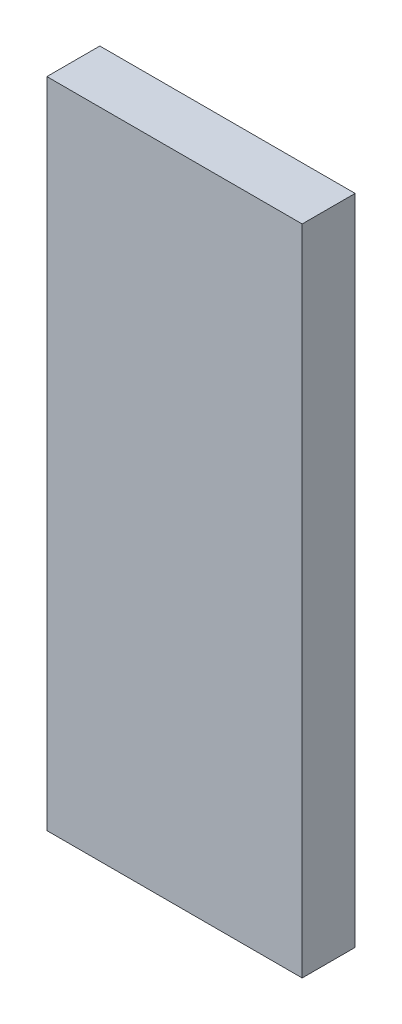
ISO-10303-21;
HEADER;
FILE_DESCRIPTION(('STEP AP214'),'2;1');
FILE_NAME('part.step','',(''),(''),'','','');
FILE_SCHEMA(('AUTOMOTIVE_DESIGN { 1 0 10303 214 1 1 1 1 }'));
ENDSEC;
DATA;
#1=APPLICATION_CONTEXT('core data for automotive mechanical design processes');
#2=APPLICATION_PROTOCOL_DEFINITION('international standard','automotive_design',2000,#1);
#3=PRODUCT_CONTEXT('',#1,'mechanical');
#4=PRODUCT('Part','Part','',(#3));
#5=PRODUCT_RELATED_PRODUCT_CATEGORY('part','',(#4));
#6=PRODUCT_DEFINITION_FORMATION('','',#4);
#7=PRODUCT_DEFINITION_CONTEXT('part definition',#1,'design');
#8=PRODUCT_DEFINITION('design','',#6,#7);
#9=PRODUCT_DEFINITION_SHAPE('','',#8);
#10=(LENGTH_UNIT() NAMED_UNIT(*) SI_UNIT(.MILLI.,.METRE.));
#11=(NAMED_UNIT(*) PLANE_ANGLE_UNIT() SI_UNIT($,.RADIAN.));
#12=(NAMED_UNIT(*) SI_UNIT($,.STERADIAN.) SOLID_ANGLE_UNIT());
#13=UNCERTAINTY_MEASURE_WITH_UNIT(LENGTH_MEASURE(1.E-05),#10,'distance_accuracy_value','');
#14=(GEOMETRIC_REPRESENTATION_CONTEXT(3) GLOBAL_UNCERTAINTY_ASSIGNED_CONTEXT((#13)) GLOBAL_UNIT_ASSIGNED_CONTEXT((#10,
#11,#12)) REPRESENTATION_CONTEXT('',''));
#15=CARTESIAN_POINT('',(0.,0.,0.));
#16=DIRECTION('',(0.,0.,1.));
#17=DIRECTION('',(1.,0.,0.));
#18=AXIS2_PLACEMENT_3D('',#15,#16,#17);
#19=CARTESIAN_POINT('',(0.67499992,-1.72667676,0.));
#20=DIRECTION('',(-1.,0.,0.));
#21=DIRECTION('',(0.,1.,0.));
#22=AXIS2_PLACEMENT_3D('',#19,#20,#21);
#23=PLANE('',#22);
#24=DIRECTION('',(0.,1.,0.));
#25=VECTOR('',#24,1.);
#26=CARTESIAN_POINT('',(0.67499992,-1.72667676,0.));
#27=LINE('',#26,#25);
#28=CARTESIAN_POINT('',(0.67499992,-1.72667676,0.));
#29=VERTEX_POINT('',#28);
#30=CARTESIAN_POINT('',(0.67499992,1.7266793,0.));
#31=VERTEX_POINT('',#30);
#32=EDGE_CURVE('E11',#29,#31,#27,.T.);
#33=ORIENTED_EDGE('',*,*,#32,.T.);
#34=DIRECTION('',(0.,0.,1.));
#35=VECTOR('',#34,1.);
#36=CARTESIAN_POINT('',(0.67499992,1.7266793,0.));
#37=LINE('',#36,#35);
#38=CARTESIAN_POINT('',(0.67499992,1.7266793,0.27999944));
#39=VERTEX_POINT('',#38);
#40=EDGE_CURVE('E24',#31,#39,#37,.T.);
#41=ORIENTED_EDGE('',*,*,#40,.T.);
#42=DIRECTION('',(0.,1.,0.));
#43=VECTOR('',#42,1.);
#44=CARTESIAN_POINT('',(0.67499992,-1.72667676,0.27999944));
#45=LINE('',#44,#43);
#46=CARTESIAN_POINT('',(0.67499992,-1.72667676,0.27999944));
#47=VERTEX_POINT('',#46);
#48=EDGE_CURVE('E87',#47,#39,#45,.T.);
#49=ORIENTED_EDGE('',*,*,#48,.F.);
#50=DIRECTION('',(0.,0.,1.));
#51=VECTOR('',#50,1.);
#52=CARTESIAN_POINT('',(0.67499992,-1.72667676,0.));
#53=LINE('',#52,#51);
#54=EDGE_CURVE('E36',#29,#47,#53,.T.);
#55=ORIENTED_EDGE('',*,*,#54,.F.);
#56=EDGE_LOOP('',(#33,#41,#49,#55));
#57=FACE_BOUND('',#56,.T.);
#58=ADVANCED_FACE('F17',(#57),#23,.F.);
#59=CARTESIAN_POINT('',(0.67499992,1.7266793,0.));
#60=DIRECTION('',(0.,-1.,0.));
#61=DIRECTION('',(-1.,0.,0.));
#62=AXIS2_PLACEMENT_3D('',#59,#60,#61);
#63=PLANE('',#62);
#64=DIRECTION('',(-1.,0.,0.));
#65=VECTOR('',#64,1.);
#66=CARTESIAN_POINT('',(0.67499992,1.7266793,0.));
#67=LINE('',#66,#65);
#68=CARTESIAN_POINT('',(-0.67499992,1.7266793,0.));
#69=VERTEX_POINT('',#68);
#70=EDGE_CURVE('E84',#31,#69,#67,.T.);
#71=ORIENTED_EDGE('',*,*,#70,.T.);
#72=DIRECTION('',(0.,0.,1.));
#73=VECTOR('',#72,1.);
#74=CARTESIAN_POINT('',(-0.67499992,1.7266793,0.));
#75=LINE('',#74,#73);
#76=CARTESIAN_POINT('',(-0.67499992,1.7266793,0.27999944));
#77=VERTEX_POINT('',#76);
#78=EDGE_CURVE('E82',#69,#77,#75,.T.);
#79=ORIENTED_EDGE('',*,*,#78,.T.);
#80=DIRECTION('',(-1.,0.,0.));
#81=VECTOR('',#80,1.);
#82=CARTESIAN_POINT('',(0.67499992,1.7266793,0.27999944));
#83=LINE('',#82,#81);
#84=EDGE_CURVE('E62',#39,#77,#83,.T.);
#85=ORIENTED_EDGE('',*,*,#84,.F.);
#86=ORIENTED_EDGE('',*,*,#40,.F.);
#87=EDGE_LOOP('',(#71,#79,#85,#86));
#88=FACE_BOUND('',#87,.T.);
#89=ADVANCED_FACE('F89',(#88),#63,.F.);
#90=CARTESIAN_POINT('',(-0.67499992,1.7266793,0.));
#91=DIRECTION('',(1.,0.,0.));
#92=DIRECTION('',(0.,-1.,0.));
#93=AXIS2_PLACEMENT_3D('',#90,#91,#92);
#94=PLANE('',#93);
#95=DIRECTION('',(0.,-1.,0.));
#96=VECTOR('',#95,1.);
#97=CARTESIAN_POINT('',(-0.67499992,1.7266793,0.));
#98=LINE('',#97,#96);
#99=CARTESIAN_POINT('',(-0.67499992,-1.72667676,0.));
#100=VERTEX_POINT('',#99);
#101=EDGE_CURVE('E71',#69,#100,#98,.T.);
#102=ORIENTED_EDGE('',*,*,#101,.T.);
#103=DIRECTION('',(0.,0.,1.));
#104=VECTOR('',#103,1.);
#105=CARTESIAN_POINT('',(-0.67499992,-1.72667676,0.));
#106=LINE('',#105,#104);
#107=CARTESIAN_POINT('',(-0.67499992,-1.72667676,0.27999944));
#108=VERTEX_POINT('',#107);
#109=EDGE_CURVE('E65',#100,#108,#106,.T.);
#110=ORIENTED_EDGE('',*,*,#109,.T.);
#111=DIRECTION('',(0.,-1.,0.));
#112=VECTOR('',#111,1.);
#113=CARTESIAN_POINT('',(-0.67499992,1.7266793,0.27999944));
#114=LINE('',#113,#112);
#115=EDGE_CURVE('E57',#77,#108,#114,.T.);
#116=ORIENTED_EDGE('',*,*,#115,.F.);
#117=ORIENTED_EDGE('',*,*,#78,.F.);
#118=EDGE_LOOP('',(#102,#110,#116,#117));
#119=FACE_BOUND('',#118,.T.);
#120=ADVANCED_FACE('F69',(#119),#94,.F.);
#121=CARTESIAN_POINT('',(-0.67499992,-1.72667676,0.));
#122=DIRECTION('',(0.,1.,0.));
#123=DIRECTION('',(1.,0.,0.));
#124=AXIS2_PLACEMENT_3D('',#121,#122,#123);
#125=PLANE('',#124);
#126=DIRECTION('',(1.,0.,0.));
#127=VECTOR('',#126,1.);
#128=CARTESIAN_POINT('',(-0.67499992,-1.72667676,0.));
#129=LINE('',#128,#127);
#130=EDGE_CURVE('E66',#100,#29,#129,.T.);
#131=ORIENTED_EDGE('',*,*,#130,.T.);
#132=ORIENTED_EDGE('',*,*,#54,.T.);
#133=DIRECTION('',(1.,0.,0.));
#134=VECTOR('',#133,1.);
#135=CARTESIAN_POINT('',(-0.67499992,-1.72667676,0.27999944));
#136=LINE('',#135,#134);
#137=EDGE_CURVE('E61',#108,#47,#136,.T.);
#138=ORIENTED_EDGE('',*,*,#137,.F.);
#139=ORIENTED_EDGE('',*,*,#109,.F.);
#140=EDGE_LOOP('',(#131,#132,#138,#139));
#141=FACE_BOUND('',#140,.T.);
#142=ADVANCED_FACE('F76',(#141),#125,.F.);
#143=CARTESIAN_POINT('',(0.,1.26999999845E-06,0.));
#144=DIRECTION('',(0.,0.,1.));
#145=DIRECTION('',(1.,0.,0.));
#146=AXIS2_PLACEMENT_3D('',#143,#144,#145);
#147=PLANE('',#146);
#148=ORIENTED_EDGE('',*,*,#130,.F.);
#149=ORIENTED_EDGE('',*,*,#101,.F.);
#150=ORIENTED_EDGE('',*,*,#70,.F.);
#151=ORIENTED_EDGE('',*,*,#32,.F.);
#152=EDGE_LOOP('',(#148,#149,#150,#151));
#153=FACE_BOUND('',#152,.T.);
#154=ADVANCED_FACE('F91',(#153),#147,.F.);
#155=CARTESIAN_POINT('',(0.,1.26999999845E-06,0.27999944));
#156=DIRECTION('',(0.,0.,1.));
#157=DIRECTION('',(1.,0.,0.));
#158=AXIS2_PLACEMENT_3D('',#155,#156,#157);
#159=PLANE('',#158);
#160=ORIENTED_EDGE('',*,*,#48,.T.);
#161=ORIENTED_EDGE('',*,*,#84,.T.);
#162=ORIENTED_EDGE('',*,*,#115,.T.);
#163=ORIENTED_EDGE('',*,*,#137,.T.);
#164=EDGE_LOOP('',(#160,#161,#162,#163));
#165=FACE_BOUND('',#164,.T.);
#166=ADVANCED_FACE('F59',(#165),#159,.T.);
#167=CLOSED_SHELL('',(#58,#89,#120,#142,#154,#166));
#168=MANIFOLD_SOLID_BREP('B1',#167);
#169=ADVANCED_BREP_SHAPE_REPRESENTATION('',(#18,#168),#14);
#170=SHAPE_DEFINITION_REPRESENTATION(#9,#169);
ENDSEC;
END-ISO-10303-21;
